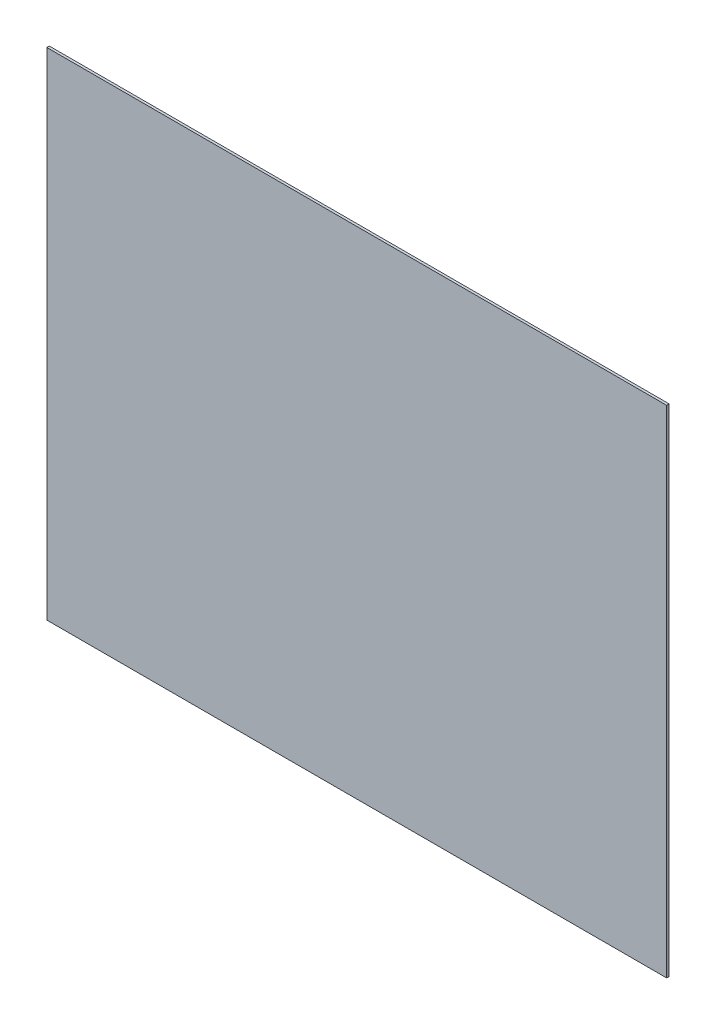
ISO-10303-21;
HEADER;
FILE_DESCRIPTION(('STEP AP214'),'2;1');
FILE_NAME('part.step','',(''),(''),'','','');
FILE_SCHEMA(('AUTOMOTIVE_DESIGN { 1 0 10303 214 1 1 1 1 }'));
ENDSEC;
DATA;
#1=APPLICATION_CONTEXT('core data for automotive mechanical design processes');
#2=APPLICATION_PROTOCOL_DEFINITION('international standard','automotive_design',2000,#1);
#3=PRODUCT_CONTEXT('',#1,'mechanical');
#4=PRODUCT('Part','Part','',(#3));
#5=PRODUCT_RELATED_PRODUCT_CATEGORY('part','',(#4));
#6=PRODUCT_DEFINITION_FORMATION('','',#4);
#7=PRODUCT_DEFINITION_CONTEXT('part definition',#1,'design');
#8=PRODUCT_DEFINITION('design','',#6,#7);
#9=PRODUCT_DEFINITION_SHAPE('','',#8);
#10=(LENGTH_UNIT() NAMED_UNIT(*) SI_UNIT(.MILLI.,.METRE.));
#11=(NAMED_UNIT(*) PLANE_ANGLE_UNIT() SI_UNIT($,.RADIAN.));
#12=(NAMED_UNIT(*) SI_UNIT($,.STERADIAN.) SOLID_ANGLE_UNIT());
#13=UNCERTAINTY_MEASURE_WITH_UNIT(LENGTH_MEASURE(1.E-05),#10,'distance_accuracy_value','');
#14=(GEOMETRIC_REPRESENTATION_CONTEXT(3) GLOBAL_UNCERTAINTY_ASSIGNED_CONTEXT((#13)) GLOBAL_UNIT_ASSIGNED_CONTEXT((#10,
#11,#12)) REPRESENTATION_CONTEXT('',''));
#15=CARTESIAN_POINT('',(0.,0.,0.));
#16=DIRECTION('',(0.,0.,1.));
#17=DIRECTION('',(1.,0.,0.));
#18=AXIS2_PLACEMENT_3D('',#15,#16,#17);
#19=CARTESIAN_POINT('',(100.,300.,-778.));
#20=DIRECTION('',(-1.,0.,0.));
#21=DIRECTION('',(0.,0.,1.));
#22=AXIS2_PLACEMENT_3D('',#19,#20,#21);
#23=PLANE('',#22);
#24=DIRECTION('',(0.,-1.,0.));
#25=VECTOR('',#24,1.);
#26=CARTESIAN_POINT('',(100.,300.,-776.));
#27=LINE('',#26,#25);
#28=CARTESIAN_POINT('',(100.,700.,-776.));
#29=VERTEX_POINT('',#28);
#30=CARTESIAN_POINT('',(100.,300.,-776.));
#31=VERTEX_POINT('',#30);
#32=EDGE_CURVE('E103',#29,#31,#27,.T.);
#33=ORIENTED_EDGE('',*,*,#32,.F.);
#34=DIRECTION('',(0.,0.,1.));
#35=VECTOR('',#34,1.);
#36=CARTESIAN_POINT('',(100.,700.,-778.));
#37=LINE('',#36,#35);
#38=CARTESIAN_POINT('',(100.,700.,-778.));
#39=VERTEX_POINT('',#38);
#40=EDGE_CURVE('E11',#39,#29,#37,.T.);
#41=ORIENTED_EDGE('',*,*,#40,.F.);
#42=DIRECTION('',(0.,-1.,0.));
#43=VECTOR('',#42,1.);
#44=CARTESIAN_POINT('',(100.,300.,-778.));
#45=LINE('',#44,#43);
#46=CARTESIAN_POINT('',(100.,300.,-778.));
#47=VERTEX_POINT('',#46);
#48=EDGE_CURVE('E97',#39,#47,#45,.T.);
#49=ORIENTED_EDGE('',*,*,#48,.T.);
#50=DIRECTION('',(0.,0.,1.));
#51=VECTOR('',#50,1.);
#52=CARTESIAN_POINT('',(100.,300.,-778.));
#53=LINE('',#52,#51);
#54=EDGE_CURVE('E42',#47,#31,#53,.T.);
#55=ORIENTED_EDGE('',*,*,#54,.T.);
#56=EDGE_LOOP('',(#33,#41,#49,#55));
#57=FACE_BOUND('',#56,.T.);
#58=ADVANCED_FACE('F39',(#57),#23,.T.);
#59=CARTESIAN_POINT('',(100.,700.,-778.));
#60=DIRECTION('',(0.,1.,0.));
#61=DIRECTION('',(0.,0.,1.));
#62=AXIS2_PLACEMENT_3D('',#59,#60,#61);
#63=PLANE('',#62);
#64=DIRECTION('',(-1.,0.,0.));
#65=VECTOR('',#64,1.);
#66=CARTESIAN_POINT('',(100.,700.,-776.));
#67=LINE('',#66,#65);
#68=CARTESIAN_POINT('',(600.,700.,-776.));
#69=VERTEX_POINT('',#68);
#70=EDGE_CURVE('E99',#69,#29,#67,.T.);
#71=ORIENTED_EDGE('',*,*,#70,.F.);
#72=DIRECTION('',(0.,0.,1.));
#73=VECTOR('',#72,1.);
#74=CARTESIAN_POINT('',(600.,700.,-778.));
#75=LINE('',#74,#73);
#76=CARTESIAN_POINT('',(600.,700.,-778.));
#77=VERTEX_POINT('',#76);
#78=EDGE_CURVE('E48',#77,#69,#75,.T.);
#79=ORIENTED_EDGE('',*,*,#78,.F.);
#80=DIRECTION('',(-1.,0.,0.));
#81=VECTOR('',#80,1.);
#82=CARTESIAN_POINT('',(100.,700.,-778.));
#83=LINE('',#82,#81);
#84=EDGE_CURVE('E94',#77,#39,#83,.T.);
#85=ORIENTED_EDGE('',*,*,#84,.T.);
#86=ORIENTED_EDGE('',*,*,#40,.T.);
#87=EDGE_LOOP('',(#71,#79,#85,#86));
#88=FACE_BOUND('',#87,.T.);
#89=ADVANCED_FACE('F113',(#88),#63,.T.);
#90=CARTESIAN_POINT('',(600.,300.,-778.));
#91=DIRECTION('',(1.,0.,0.));
#92=DIRECTION('',(0.,0.,-1.));
#93=AXIS2_PLACEMENT_3D('',#90,#91,#92);
#94=PLANE('',#93);
#95=DIRECTION('',(0.,1.,0.));
#96=VECTOR('',#95,1.);
#97=CARTESIAN_POINT('',(600.,300.,-776.));
#98=LINE('',#97,#96);
#99=CARTESIAN_POINT('',(600.,300.,-776.));
#100=VERTEX_POINT('',#99);
#101=EDGE_CURVE('E89',#100,#69,#98,.T.);
#102=ORIENTED_EDGE('',*,*,#101,.F.);
#103=DIRECTION('',(0.,0.,1.));
#104=VECTOR('',#103,1.);
#105=CARTESIAN_POINT('',(600.,300.,-778.));
#106=LINE('',#105,#104);
#107=CARTESIAN_POINT('',(600.,300.,-778.));
#108=VERTEX_POINT('',#107);
#109=EDGE_CURVE('E84',#108,#100,#106,.T.);
#110=ORIENTED_EDGE('',*,*,#109,.F.);
#111=DIRECTION('',(0.,1.,0.));
#112=VECTOR('',#111,1.);
#113=CARTESIAN_POINT('',(600.,300.,-778.));
#114=LINE('',#113,#112);
#115=EDGE_CURVE('E87',#108,#77,#114,.T.);
#116=ORIENTED_EDGE('',*,*,#115,.T.);
#117=ORIENTED_EDGE('',*,*,#78,.T.);
#118=EDGE_LOOP('',(#102,#110,#116,#117));
#119=FACE_BOUND('',#118,.T.);
#120=ADVANCED_FACE('F86',(#119),#94,.T.);
#121=CARTESIAN_POINT('',(100.,300.,-778.));
#122=DIRECTION('',(0.,-1.,0.));
#123=DIRECTION('',(0.,0.,-1.));
#124=AXIS2_PLACEMENT_3D('',#121,#122,#123);
#125=PLANE('',#124);
#126=DIRECTION('',(1.,0.,0.));
#127=VECTOR('',#126,1.);
#128=CARTESIAN_POINT('',(100.,300.,-776.));
#129=LINE('',#128,#127);
#130=EDGE_CURVE('E106',#31,#100,#129,.T.);
#131=ORIENTED_EDGE('',*,*,#130,.F.);
#132=ORIENTED_EDGE('',*,*,#54,.F.);
#133=DIRECTION('',(1.,0.,0.));
#134=VECTOR('',#133,1.);
#135=CARTESIAN_POINT('',(100.,300.,-778.));
#136=LINE('',#135,#134);
#137=EDGE_CURVE('E93',#47,#108,#136,.T.);
#138=ORIENTED_EDGE('',*,*,#137,.T.);
#139=ORIENTED_EDGE('',*,*,#109,.T.);
#140=EDGE_LOOP('',(#131,#132,#138,#139));
#141=FACE_BOUND('',#140,.T.);
#142=ADVANCED_FACE('F96',(#141),#125,.T.);
#143=CARTESIAN_POINT('',(0.,0.,-778.));
#144=DIRECTION('',(0.,0.,-1.));
#145=DIRECTION('',(-1.,0.,0.));
#146=AXIS2_PLACEMENT_3D('',#143,#144,#145);
#147=PLANE('',#146);
#148=ORIENTED_EDGE('',*,*,#48,.F.);
#149=ORIENTED_EDGE('',*,*,#84,.F.);
#150=ORIENTED_EDGE('',*,*,#115,.F.);
#151=ORIENTED_EDGE('',*,*,#137,.F.);
#152=EDGE_LOOP('',(#148,#149,#150,#151));
#153=FACE_BOUND('',#152,.T.);
#154=ADVANCED_FACE('F92',(#153),#147,.T.);
#155=CARTESIAN_POINT('',(0.,0.,-776.));
#156=DIRECTION('',(0.,0.,-1.));
#157=DIRECTION('',(-1.,0.,0.));
#158=AXIS2_PLACEMENT_3D('',#155,#156,#157);
#159=PLANE('',#158);
#160=ORIENTED_EDGE('',*,*,#32,.T.);
#161=ORIENTED_EDGE('',*,*,#130,.T.);
#162=ORIENTED_EDGE('',*,*,#101,.T.);
#163=ORIENTED_EDGE('',*,*,#70,.T.);
#164=EDGE_LOOP('',(#160,#161,#162,#163));
#165=FACE_BOUND('',#164,.T.);
#166=ADVANCED_FACE('F112',(#165),#159,.F.);
#167=CLOSED_SHELL('',(#58,#89,#120,#142,#154,#166));
#168=MANIFOLD_SOLID_BREP('B2',#167);
#169=ADVANCED_BREP_SHAPE_REPRESENTATION('',(#18,#168),#14);
#170=SHAPE_DEFINITION_REPRESENTATION(#9,#169);
ENDSEC;
END-ISO-10303-21;
